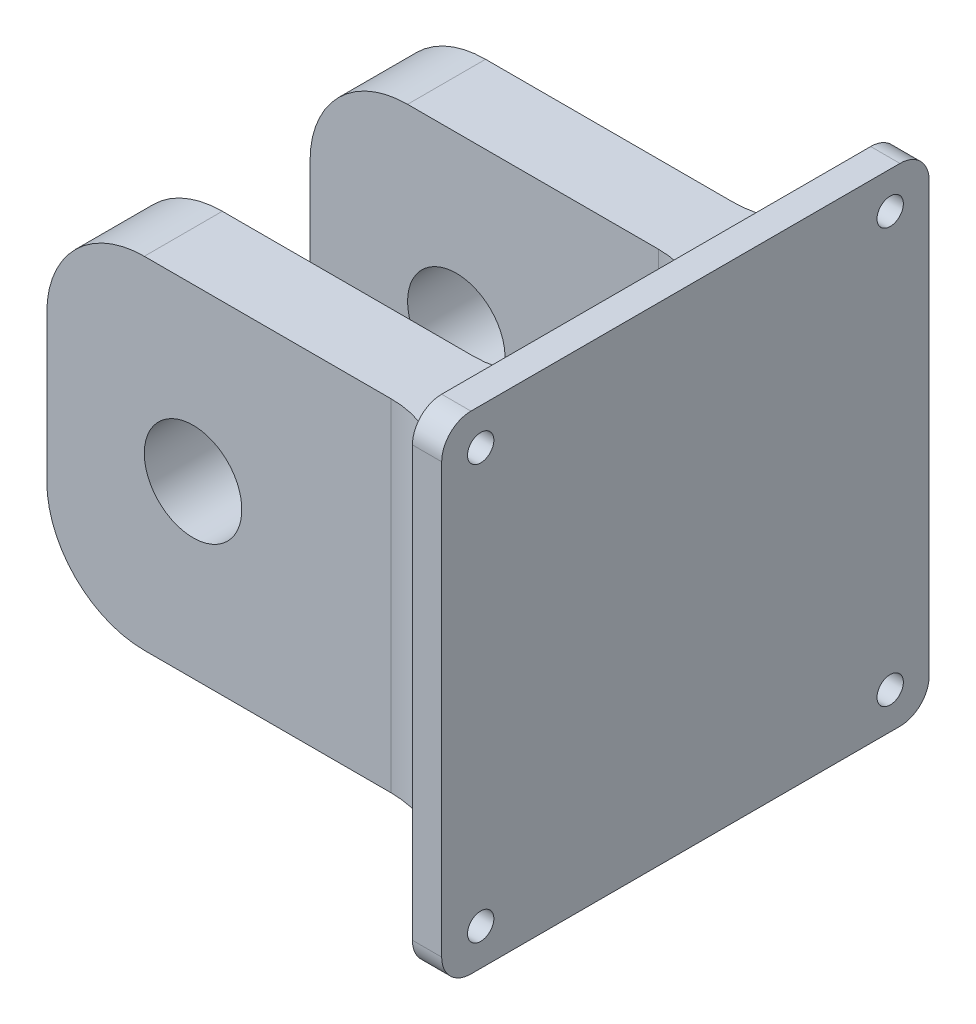
ISO-10303-21;
HEADER;
FILE_DESCRIPTION(('STEP AP214'),'2;1');
FILE_NAME('part.step','',(''),(''),'','','');
FILE_SCHEMA(('AUTOMOTIVE_DESIGN { 1 0 10303 214 1 1 1 1 }'));
ENDSEC;
DATA;
#1=APPLICATION_CONTEXT('core data for automotive mechanical design processes');
#2=APPLICATION_PROTOCOL_DEFINITION('international standard','automotive_design',2000,#1);
#3=PRODUCT_CONTEXT('',#1,'mechanical');
#4=PRODUCT('Part','Part','',(#3));
#5=PRODUCT_RELATED_PRODUCT_CATEGORY('part','',(#4));
#6=PRODUCT_DEFINITION_FORMATION('','',#4);
#7=PRODUCT_DEFINITION_CONTEXT('part definition',#1,'design');
#8=PRODUCT_DEFINITION('design','',#6,#7);
#9=PRODUCT_DEFINITION_SHAPE('','',#8);
#10=(LENGTH_UNIT() NAMED_UNIT(*) SI_UNIT(.MILLI.,.METRE.));
#11=(NAMED_UNIT(*) PLANE_ANGLE_UNIT() SI_UNIT($,.RADIAN.));
#12=(NAMED_UNIT(*) SI_UNIT($,.STERADIAN.) SOLID_ANGLE_UNIT());
#13=UNCERTAINTY_MEASURE_WITH_UNIT(LENGTH_MEASURE(1.E-05),#10,'distance_accuracy_value','');
#14=(GEOMETRIC_REPRESENTATION_CONTEXT(3) GLOBAL_UNCERTAINTY_ASSIGNED_CONTEXT((#13)) GLOBAL_UNIT_ASSIGNED_CONTEXT((#10,
#11,#12)) REPRESENTATION_CONTEXT('',''));
#15=CARTESIAN_POINT('',(0.,0.,0.));
#16=DIRECTION('',(0.,0.,1.));
#17=DIRECTION('',(1.,0.,0.));
#18=AXIS2_PLACEMENT_3D('',#15,#16,#17);
#19=CARTESIAN_POINT('',(0.,0.,0.));
#20=DIRECTION('',(-1.,0.,0.));
#21=DIRECTION('',(0.,0.,1.));
#22=AXIS2_PLACEMENT_3D('',#19,#20,#21);
#23=PLANE('',#22);
#24=CARTESIAN_POINT('',(0.,21.25,21.));
#25=DIRECTION('',(-1.,0.,0.));
#26=DIRECTION('',(0.,0.,1.));
#27=AXIS2_PLACEMENT_3D('',#24,#25,#26);
#28=CIRCLE('',#27,1.35);
#29=CARTESIAN_POINT('',(0.,21.25,22.35));
#30=VERTEX_POINT('',#29);
#31=EDGE_CURVE('E440',#30,#30,#28,.T.);
#32=ORIENTED_EDGE('',*,*,#31,.F.);
#33=EDGE_LOOP('',(#32));
#34=FACE_BOUND('',#33,.T.);
#35=CARTESIAN_POINT('',(0.,21.25,-21.));
#36=DIRECTION('',(-1.,0.,0.));
#37=DIRECTION('',(0.,0.,1.));
#38=AXIS2_PLACEMENT_3D('',#35,#36,#37);
#39=CIRCLE('',#38,1.35);
#40=CARTESIAN_POINT('',(0.,21.25,-19.65));
#41=VERTEX_POINT('',#40);
#42=EDGE_CURVE('E434',#41,#41,#39,.T.);
#43=ORIENTED_EDGE('',*,*,#42,.F.);
#44=EDGE_LOOP('',(#43));
#45=FACE_BOUND('',#44,.T.);
#46=CARTESIAN_POINT('',(0.,-21.25,-21.));
#47=DIRECTION('',(-1.,0.,0.));
#48=DIRECTION('',(0.,0.,1.));
#49=AXIS2_PLACEMENT_3D('',#46,#47,#48);
#50=CIRCLE('',#49,1.35);
#51=CARTESIAN_POINT('',(0.,-21.25,-19.65));
#52=VERTEX_POINT('',#51);
#53=EDGE_CURVE('E428',#52,#52,#50,.T.);
#54=ORIENTED_EDGE('',*,*,#53,.F.);
#55=EDGE_LOOP('',(#54));
#56=FACE_BOUND('',#55,.T.);
#57=CARTESIAN_POINT('',(0.,-21.25,21.));
#58=DIRECTION('',(-1.,0.,0.));
#59=DIRECTION('',(0.,0.,1.));
#60=AXIS2_PLACEMENT_3D('',#57,#58,#59);
#61=CIRCLE('',#60,1.35);
#62=CARTESIAN_POINT('',(0.,-21.25,22.35));
#63=VERTEX_POINT('',#62);
#64=EDGE_CURVE('E422',#63,#63,#61,.T.);
#65=ORIENTED_EDGE('',*,*,#64,.F.);
#66=EDGE_LOOP('',(#65));
#67=FACE_BOUND('',#66,.T.);
#68=DIRECTION('',(0.,0.,-1.));
#69=VECTOR('',#68,1.);
#70=CARTESIAN_POINT('',(0.,-25.,25.));
#71=LINE('',#70,#69);
#72=CARTESIAN_POINT('',(0.,-25.,22.));
#73=VERTEX_POINT('',#72);
#74=CARTESIAN_POINT('',(0.,-25.,-22.));
#75=VERTEX_POINT('',#74);
#76=EDGE_CURVE('E247',#73,#75,#71,.T.);
#77=ORIENTED_EDGE('',*,*,#76,.F.);
#78=CARTESIAN_POINT('',(0.,-22.,22.));
#79=DIRECTION('',(-1.,0.,0.));
#80=DIRECTION('',(0.,0.,1.));
#81=AXIS2_PLACEMENT_3D('',#78,#79,#80);
#82=CIRCLE('',#81,3.);
#83=CARTESIAN_POINT('',(0.,-22.,25.));
#84=VERTEX_POINT('',#83);
#85=EDGE_CURVE('E334',#73,#84,#82,.T.);
#86=ORIENTED_EDGE('',*,*,#85,.T.);
#87=DIRECTION('',(0.,-1.,0.));
#88=VECTOR('',#87,1.);
#89=CARTESIAN_POINT('',(0.,-25.,25.));
#90=LINE('',#89,#88);
#91=CARTESIAN_POINT('',(0.,-17.5,25.));
#92=VERTEX_POINT('',#91);
#93=EDGE_CURVE('E244',#92,#84,#90,.T.);
#94=ORIENTED_EDGE('',*,*,#93,.F.);
#95=DIRECTION('',(0.,0.,1.));
#96=VECTOR('',#95,1.);
#97=CARTESIAN_POINT('',(0.,-17.5,9.49999999999999));
#98=LINE('',#97,#96);
#99=CARTESIAN_POINT('',(0.,-17.5,0.24999999999999));
#100=VERTEX_POINT('',#99);
#101=EDGE_CURVE('E390',#100,#92,#98,.T.);
#102=ORIENTED_EDGE('',*,*,#101,.F.);
#103=DIRECTION('',(0.,-1.,0.));
#104=VECTOR('',#103,1.);
#105=CARTESIAN_POINT('',(0.,0.,0.249999999999992));
#106=LINE('',#105,#104);
#107=CARTESIAN_POINT('',(0.,17.5,0.249999999999993));
#108=VERTEX_POINT('',#107);
#109=EDGE_CURVE('E306',#100,#108,#106,.F.);
#110=ORIENTED_EDGE('',*,*,#109,.T.);
#111=DIRECTION('',(0.,0.,1.));
#112=VECTOR('',#111,1.);
#113=CARTESIAN_POINT('',(0.,17.5,9.49999999999999));
#114=LINE('',#113,#112);
#115=CARTESIAN_POINT('',(0.,17.5,25.));
#116=VERTEX_POINT('',#115);
#117=EDGE_CURVE('E387',#108,#116,#114,.T.);
#118=ORIENTED_EDGE('',*,*,#117,.T.);
#119=CARTESIAN_POINT('',(0.,22.,25.));
#120=VERTEX_POINT('',#119);
#121=EDGE_CURVE('E245',#120,#116,#90,.T.);
#122=ORIENTED_EDGE('',*,*,#121,.F.);
#123=CARTESIAN_POINT('',(0.,22.,22.));
#124=DIRECTION('',(-1.,0.,0.));
#125=DIRECTION('',(0.,0.,1.));
#126=AXIS2_PLACEMENT_3D('',#123,#124,#125);
#127=CIRCLE('',#126,3.);
#128=CARTESIAN_POINT('',(0.,25.,22.));
#129=VERTEX_POINT('',#128);
#130=EDGE_CURVE('E332',#120,#129,#127,.T.);
#131=ORIENTED_EDGE('',*,*,#130,.T.);
#132=DIRECTION('',(0.,0.,1.));
#133=VECTOR('',#132,1.);
#134=CARTESIAN_POINT('',(0.,25.,25.));
#135=LINE('',#134,#133);
#136=CARTESIAN_POINT('',(0.,25.,-22.));
#137=VERTEX_POINT('',#136);
#138=EDGE_CURVE('E209',#137,#129,#135,.T.);
#139=ORIENTED_EDGE('',*,*,#138,.F.);
#140=CARTESIAN_POINT('',(0.,22.,-22.));
#141=DIRECTION('',(-1.,0.,0.));
#142=DIRECTION('',(0.,0.,1.));
#143=AXIS2_PLACEMENT_3D('',#140,#141,#142);
#144=CIRCLE('',#143,3.);
#145=CARTESIAN_POINT('',(0.,22.,-25.));
#146=VERTEX_POINT('',#145);
#147=EDGE_CURVE('E330',#137,#146,#144,.T.);
#148=ORIENTED_EDGE('',*,*,#147,.T.);
#149=DIRECTION('',(0.,1.,0.));
#150=VECTOR('',#149,1.);
#151=CARTESIAN_POINT('',(0.,-25.,-25.));
#152=LINE('',#151,#150);
#153=CARTESIAN_POINT('',(0.,17.5,-25.));
#154=VERTEX_POINT('',#153);
#155=EDGE_CURVE('E211',#154,#146,#152,.T.);
#156=ORIENTED_EDGE('',*,*,#155,.F.);
#157=DIRECTION('',(0.,0.,1.));
#158=VECTOR('',#157,1.);
#159=CARTESIAN_POINT('',(0.,17.5,-17.5));
#160=LINE('',#159,#158);
#161=CARTESIAN_POINT('',(0.,17.5,-0.250000000000014));
#162=VERTEX_POINT('',#161);
#163=EDGE_CURVE('E220',#154,#162,#160,.T.);
#164=ORIENTED_EDGE('',*,*,#163,.T.);
#165=DIRECTION('',(0.,1.,0.));
#166=VECTOR('',#165,1.);
#167=CARTESIAN_POINT('',(0.,0.,-0.250000000000014));
#168=LINE('',#167,#166);
#169=CARTESIAN_POINT('',(0.,-17.5,-0.250000000000014));
#170=VERTEX_POINT('',#169);
#171=EDGE_CURVE('E217',#162,#170,#168,.F.);
#172=ORIENTED_EDGE('',*,*,#171,.T.);
#173=DIRECTION('',(0.,0.,1.));
#174=VECTOR('',#173,1.);
#175=CARTESIAN_POINT('',(0.,-17.5,-17.5));
#176=LINE('',#175,#174);
#177=CARTESIAN_POINT('',(0.,-17.5,-25.));
#178=VERTEX_POINT('',#177);
#179=EDGE_CURVE('E213',#178,#170,#176,.T.);
#180=ORIENTED_EDGE('',*,*,#179,.F.);
#181=CARTESIAN_POINT('',(0.,-22.,-25.));
#182=VERTEX_POINT('',#181);
#183=EDGE_CURVE('E200',#182,#178,#152,.T.);
#184=ORIENTED_EDGE('',*,*,#183,.F.);
#185=CARTESIAN_POINT('',(0.,-22.,-22.));
#186=DIRECTION('',(-1.,0.,0.));
#187=DIRECTION('',(0.,0.,1.));
#188=AXIS2_PLACEMENT_3D('',#185,#186,#187);
#189=CIRCLE('',#188,3.);
#190=EDGE_CURVE('E328',#182,#75,#189,.T.);
#191=ORIENTED_EDGE('',*,*,#190,.T.);
#192=EDGE_LOOP('',(#77,#86,#94,#102,#110,#118,#122,#131,#139,#148,#156,#164,#172,#180,#184,#191));
#193=FACE_BOUND('',#192,.T.);
#194=ADVANCED_FACE('F37',(#34,#45,#56,#67,#193),#23,.T.);
#195=CARTESIAN_POINT('',(3.,-25.,-25.));
#196=DIRECTION('',(0.,0.,1.));
#197=DIRECTION('',(1.,0.,0.));
#198=AXIS2_PLACEMENT_3D('',#195,#196,#197);
#199=PLANE('',#198);
#200=ORIENTED_EDGE('',*,*,#155,.T.);
#201=DIRECTION('',(-1.,0.,0.));
#202=VECTOR('',#201,1.);
#203=CARTESIAN_POINT('',(3.,22.,-25.));
#204=LINE('',#203,#202);
#205=CARTESIAN_POINT('',(3.,22.,-25.));
#206=VERTEX_POINT('',#205);
#207=EDGE_CURVE('E11',#146,#206,#204,.F.);
#208=ORIENTED_EDGE('',*,*,#207,.T.);
#209=DIRECTION('',(0.,1.,0.));
#210=VECTOR('',#209,1.);
#211=CARTESIAN_POINT('',(3.,-25.,-25.));
#212=LINE('',#211,#210);
#213=CARTESIAN_POINT('',(3.,-22.,-25.));
#214=VERTEX_POINT('',#213);
#215=EDGE_CURVE('E251',#214,#206,#212,.T.);
#216=ORIENTED_EDGE('',*,*,#215,.F.);
#217=DIRECTION('',(-1.,0.,0.));
#218=VECTOR('',#217,1.);
#219=CARTESIAN_POINT('',(3.,-22.,-25.));
#220=LINE('',#219,#218);
#221=EDGE_CURVE('E45',#214,#182,#220,.T.);
#222=ORIENTED_EDGE('',*,*,#221,.T.);
#223=ORIENTED_EDGE('',*,*,#183,.T.);
#224=EDGE_CURVE('E205',#178,#154,#152,.T.);
#225=ORIENTED_EDGE('',*,*,#224,.T.);
#226=EDGE_LOOP('',(#200,#208,#216,#222,#223,#225));
#227=FACE_BOUND('',#226,.T.);
#228=ADVANCED_FACE('F203',(#227),#199,.F.);
#229=CARTESIAN_POINT('',(3.,25.,25.));
#230=DIRECTION('',(0.,-1.,0.));
#231=DIRECTION('',(0.,0.,-1.));
#232=AXIS2_PLACEMENT_3D('',#229,#230,#231);
#233=PLANE('',#232);
#234=ORIENTED_EDGE('',*,*,#138,.T.);
#235=DIRECTION('',(-1.,0.,0.));
#236=VECTOR('',#235,1.);
#237=CARTESIAN_POINT('',(3.,25.,22.));
#238=LINE('',#237,#236);
#239=CARTESIAN_POINT('',(3.,25.,22.));
#240=VERTEX_POINT('',#239);
#241=EDGE_CURVE('E52',#129,#240,#238,.F.);
#242=ORIENTED_EDGE('',*,*,#241,.T.);
#243=DIRECTION('',(0.,0.,1.));
#244=VECTOR('',#243,1.);
#245=CARTESIAN_POINT('',(3.,25.,25.));
#246=LINE('',#245,#244);
#247=CARTESIAN_POINT('',(3.,25.,-22.));
#248=VERTEX_POINT('',#247);
#249=EDGE_CURVE('E354',#248,#240,#246,.T.);
#250=ORIENTED_EDGE('',*,*,#249,.F.);
#251=DIRECTION('',(-1.,0.,0.));
#252=VECTOR('',#251,1.);
#253=CARTESIAN_POINT('',(3.,25.,-22.));
#254=LINE('',#253,#252);
#255=EDGE_CURVE('E348',#248,#137,#254,.T.);
#256=ORIENTED_EDGE('',*,*,#255,.T.);
#257=EDGE_LOOP('',(#234,#242,#250,#256));
#258=FACE_BOUND('',#257,.T.);
#259=ADVANCED_FACE('F353',(#258),#233,.F.);
#260=CARTESIAN_POINT('',(3.,-25.,25.));
#261=DIRECTION('',(0.,0.,-1.));
#262=DIRECTION('',(-1.,0.,0.));
#263=AXIS2_PLACEMENT_3D('',#260,#261,#262);
#264=PLANE('',#263);
#265=ORIENTED_EDGE('',*,*,#93,.T.);
#266=DIRECTION('',(-1.,0.,0.));
#267=VECTOR('',#266,1.);
#268=CARTESIAN_POINT('',(3.,-22.,25.));
#269=LINE('',#268,#267);
#270=CARTESIAN_POINT('',(3.,-22.,25.));
#271=VERTEX_POINT('',#270);
#272=EDGE_CURVE('E339',#84,#271,#269,.F.);
#273=ORIENTED_EDGE('',*,*,#272,.T.);
#274=DIRECTION('',(0.,-1.,0.));
#275=VECTOR('',#274,1.);
#276=CARTESIAN_POINT('',(3.,-25.,25.));
#277=LINE('',#276,#275);
#278=CARTESIAN_POINT('',(3.,22.,25.));
#279=VERTEX_POINT('',#278);
#280=EDGE_CURVE('E368',#279,#271,#277,.T.);
#281=ORIENTED_EDGE('',*,*,#280,.F.);
#282=DIRECTION('',(-1.,0.,0.));
#283=VECTOR('',#282,1.);
#284=CARTESIAN_POINT('',(3.,22.,25.));
#285=LINE('',#284,#283);
#286=EDGE_CURVE('E336',#279,#120,#285,.T.);
#287=ORIENTED_EDGE('',*,*,#286,.T.);
#288=ORIENTED_EDGE('',*,*,#121,.T.);
#289=EDGE_CURVE('E248',#116,#92,#90,.T.);
#290=ORIENTED_EDGE('',*,*,#289,.T.);
#291=EDGE_LOOP('',(#265,#273,#281,#287,#288,#290));
#292=FACE_BOUND('',#291,.T.);
#293=ADVANCED_FACE('F365',(#292),#264,.F.);
#294=CARTESIAN_POINT('',(3.,-25.,25.));
#295=DIRECTION('',(0.,1.,0.));
#296=DIRECTION('',(0.,0.,1.));
#297=AXIS2_PLACEMENT_3D('',#294,#295,#296);
#298=PLANE('',#297);
#299=DIRECTION('',(0.,0.,-1.));
#300=VECTOR('',#299,1.);
#301=CARTESIAN_POINT('',(3.,-25.,25.));
#302=LINE('',#301,#300);
#303=CARTESIAN_POINT('',(3.,-25.,22.));
#304=VERTEX_POINT('',#303);
#305=CARTESIAN_POINT('',(3.,-25.,-22.));
#306=VERTEX_POINT('',#305);
#307=EDGE_CURVE('E241',#304,#306,#302,.T.);
#308=ORIENTED_EDGE('',*,*,#307,.F.);
#309=DIRECTION('',(-1.,0.,0.));
#310=VECTOR('',#309,1.);
#311=CARTESIAN_POINT('',(3.,-25.,22.));
#312=LINE('',#311,#310);
#313=EDGE_CURVE('E325',#304,#73,#312,.T.);
#314=ORIENTED_EDGE('',*,*,#313,.T.);
#315=ORIENTED_EDGE('',*,*,#76,.T.);
#316=DIRECTION('',(-1.,0.,0.));
#317=VECTOR('',#316,1.);
#318=CARTESIAN_POINT('',(3.,-25.,-22.));
#319=LINE('',#318,#317);
#320=EDGE_CURVE('E323',#75,#306,#319,.F.);
#321=ORIENTED_EDGE('',*,*,#320,.T.);
#322=EDGE_LOOP('',(#308,#314,#315,#321));
#323=FACE_BOUND('',#322,.T.);
#324=ADVANCED_FACE('F517',(#323),#298,.F.);
#325=CARTESIAN_POINT('',(3.,0.,0.));
#326=DIRECTION('',(-1.,0.,0.));
#327=DIRECTION('',(0.,0.,1.));
#328=AXIS2_PLACEMENT_3D('',#325,#326,#327);
#329=PLANE('',#328);
#330=CARTESIAN_POINT('',(3.,21.25,21.));
#331=DIRECTION('',(-1.,0.,0.));
#332=DIRECTION('',(0.,0.,1.));
#333=AXIS2_PLACEMENT_3D('',#330,#331,#332);
#334=CIRCLE('',#333,1.35);
#335=CARTESIAN_POINT('',(3.,21.25,22.35));
#336=VERTEX_POINT('',#335);
#337=EDGE_CURVE('E437',#336,#336,#334,.T.);
#338=ORIENTED_EDGE('',*,*,#337,.T.);
#339=EDGE_LOOP('',(#338));
#340=FACE_BOUND('',#339,.T.);
#341=CARTESIAN_POINT('',(3.,21.25,-21.));
#342=DIRECTION('',(-1.,0.,0.));
#343=DIRECTION('',(0.,0.,1.));
#344=AXIS2_PLACEMENT_3D('',#341,#342,#343);
#345=CIRCLE('',#344,1.35);
#346=CARTESIAN_POINT('',(3.,21.25,-19.65));
#347=VERTEX_POINT('',#346);
#348=EDGE_CURVE('E431',#347,#347,#345,.T.);
#349=ORIENTED_EDGE('',*,*,#348,.T.);
#350=EDGE_LOOP('',(#349));
#351=FACE_BOUND('',#350,.T.);
#352=CARTESIAN_POINT('',(3.,-21.25,-21.));
#353=DIRECTION('',(-1.,0.,0.));
#354=DIRECTION('',(0.,0.,1.));
#355=AXIS2_PLACEMENT_3D('',#352,#353,#354);
#356=CIRCLE('',#355,1.35);
#357=CARTESIAN_POINT('',(3.,-21.25,-19.65));
#358=VERTEX_POINT('',#357);
#359=EDGE_CURVE('E425',#358,#358,#356,.T.);
#360=ORIENTED_EDGE('',*,*,#359,.T.);
#361=EDGE_LOOP('',(#360));
#362=FACE_BOUND('',#361,.T.);
#363=CARTESIAN_POINT('',(3.,-21.25,21.));
#364=DIRECTION('',(-1.,0.,0.));
#365=DIRECTION('',(0.,0.,1.));
#366=AXIS2_PLACEMENT_3D('',#363,#364,#365);
#367=CIRCLE('',#366,1.35);
#368=CARTESIAN_POINT('',(3.,-21.25,22.35));
#369=VERTEX_POINT('',#368);
#370=EDGE_CURVE('E419',#369,#369,#367,.T.);
#371=ORIENTED_EDGE('',*,*,#370,.T.);
#372=EDGE_LOOP('',(#371));
#373=FACE_BOUND('',#372,.T.);
#374=ORIENTED_EDGE('',*,*,#280,.T.);
#375=CARTESIAN_POINT('',(3.,-22.,22.));
#376=DIRECTION('',(-1.,0.,0.));
#377=DIRECTION('',(0.,0.,1.));
#378=AXIS2_PLACEMENT_3D('',#375,#376,#377);
#379=CIRCLE('',#378,3.);
#380=EDGE_CURVE('E346',#271,#304,#379,.F.);
#381=ORIENTED_EDGE('',*,*,#380,.T.);
#382=ORIENTED_EDGE('',*,*,#307,.T.);
#383=CARTESIAN_POINT('',(3.,-22.,-22.));
#384=DIRECTION('',(-1.,0.,0.));
#385=DIRECTION('',(0.,0.,1.));
#386=AXIS2_PLACEMENT_3D('',#383,#384,#385);
#387=CIRCLE('',#386,3.);
#388=EDGE_CURVE('E341',#306,#214,#387,.F.);
#389=ORIENTED_EDGE('',*,*,#388,.T.);
#390=ORIENTED_EDGE('',*,*,#215,.T.);
#391=CARTESIAN_POINT('',(3.,22.,-22.));
#392=DIRECTION('',(-1.,0.,0.));
#393=DIRECTION('',(0.,0.,1.));
#394=AXIS2_PLACEMENT_3D('',#391,#392,#393);
#395=CIRCLE('',#394,3.);
#396=EDGE_CURVE('E59',#206,#248,#395,.F.);
#397=ORIENTED_EDGE('',*,*,#396,.T.);
#398=ORIENTED_EDGE('',*,*,#249,.T.);
#399=CARTESIAN_POINT('',(3.,22.,22.));
#400=DIRECTION('',(-1.,0.,0.));
#401=DIRECTION('',(0.,0.,1.));
#402=AXIS2_PLACEMENT_3D('',#399,#400,#401);
#403=CIRCLE('',#402,3.);
#404=EDGE_CURVE('E344',#240,#279,#403,.F.);
#405=ORIENTED_EDGE('',*,*,#404,.T.);
#406=EDGE_LOOP('',(#374,#381,#382,#389,#390,#397,#398,#405));
#407=FACE_BOUND('',#406,.T.);
#408=ADVANCED_FACE('F514',(#340,#351,#362,#373,#407),#329,.F.);
#409=CARTESIAN_POINT('',(-45.,17.5,9.49999999999999));
#410=DIRECTION('',(0.,0.,1.));
#411=DIRECTION('',(0.,-1.,0.));
#412=AXIS2_PLACEMENT_3D('',#409,#410,#411);
#413=PLANE('',#412);
#414=CARTESIAN_POINT('',(-30.,0.,9.49999999999999));
#415=DIRECTION('',(0.,0.,1.));
#416=DIRECTION('',(0.,-1.,0.));
#417=AXIS2_PLACEMENT_3D('',#414,#415,#416);
#418=CIRCLE('',#417,5.);
#419=CARTESIAN_POINT('',(-35.,0.,9.49999999999999));
#420=VERTEX_POINT('',#419);
#421=EDGE_CURVE('E405',#420,#420,#418,.T.);
#422=ORIENTED_EDGE('',*,*,#421,.T.);
#423=EDGE_LOOP('',(#422));
#424=FACE_BOUND('',#423,.T.);
#425=DIRECTION('',(1.,0.,0.));
#426=VECTOR('',#425,1.);
#427=CARTESIAN_POINT('',(-45.,17.5,9.49999999999999));
#428=LINE('',#427,#426);
#429=CARTESIAN_POINT('',(-35.,17.5,9.49999999999999));
#430=VERTEX_POINT('',#429);
#431=CARTESIAN_POINT('',(-9.25000000000002,17.5,9.49999999999999));
#432=VERTEX_POINT('',#431);
#433=EDGE_CURVE('E383',#430,#432,#428,.T.);
#434=ORIENTED_EDGE('',*,*,#433,.T.);
#435=DIRECTION('',(0.,-1.,0.));
#436=VECTOR('',#435,1.);
#437=CARTESIAN_POINT('',(-9.25,17.5,9.49999999999999));
#438=LINE('',#437,#436);
#439=CARTESIAN_POINT('',(-9.25000000000002,-17.5,9.49999999999999));
#440=VERTEX_POINT('',#439);
#441=EDGE_CURVE('E310',#432,#440,#438,.T.);
#442=ORIENTED_EDGE('',*,*,#441,.T.);
#443=DIRECTION('',(1.,0.,0.));
#444=VECTOR('',#443,1.);
#445=CARTESIAN_POINT('',(-45.,-17.5,9.49999999999999));
#446=LINE('',#445,#444);
#447=CARTESIAN_POINT('',(-35.,-17.5,9.49999999999999));
#448=VERTEX_POINT('',#447);
#449=EDGE_CURVE('E238',#448,#440,#446,.T.);
#450=ORIENTED_EDGE('',*,*,#449,.F.);
#451=CARTESIAN_POINT('',(-35.,-7.5,9.49999999999999));
#452=DIRECTION('',(0.,0.,1.));
#453=DIRECTION('',(0.,-1.,0.));
#454=AXIS2_PLACEMENT_3D('',#451,#452,#453);
#455=CIRCLE('',#454,10.);
#456=CARTESIAN_POINT('',(-45.,-7.5,9.49999999999999));
#457=VERTEX_POINT('',#456);
#458=EDGE_CURVE('E278',#448,#457,#455,.F.);
#459=ORIENTED_EDGE('',*,*,#458,.T.);
#460=DIRECTION('',(0.,-1.,0.));
#461=VECTOR('',#460,1.);
#462=CARTESIAN_POINT('',(-45.,17.5,9.49999999999999));
#463=LINE('',#462,#461);
#464=CARTESIAN_POINT('',(-45.,7.50000000000001,9.49999999999999));
#465=VERTEX_POINT('',#464);
#466=EDGE_CURVE('E389',#465,#457,#463,.T.);
#467=ORIENTED_EDGE('',*,*,#466,.F.);
#468=CARTESIAN_POINT('',(-35.,7.50000000000001,9.49999999999999));
#469=DIRECTION('',(0.,0.,1.));
#470=DIRECTION('',(0.,-1.,0.));
#471=AXIS2_PLACEMENT_3D('',#468,#469,#470);
#472=CIRCLE('',#471,10.);
#473=EDGE_CURVE('E280',#465,#430,#472,.F.);
#474=ORIENTED_EDGE('',*,*,#473,.T.);
#475=EDGE_LOOP('',(#434,#442,#450,#459,#467,#474));
#476=FACE_BOUND('',#475,.T.);
#477=ADVANCED_FACE('F510',(#424,#476),#413,.F.);
#478=CARTESIAN_POINT('',(-45.,-17.5,9.49999999999999));
#479=DIRECTION('',(0.,1.,0.));
#480=DIRECTION('',(0.,0.,1.));
#481=AXIS2_PLACEMENT_3D('',#478,#479,#480);
#482=PLANE('',#481);
#483=DIRECTION('',(1.,0.,0.));
#484=VECTOR('',#483,1.);
#485=CARTESIAN_POINT('',(-45.,-17.5,17.5));
#486=LINE('',#485,#484);
#487=CARTESIAN_POINT('',(-35.,-17.5,17.5));
#488=VERTEX_POINT('',#487);
#489=CARTESIAN_POINT('',(-9.68245836551856,-17.5,17.5));
#490=VERTEX_POINT('',#489);
#491=EDGE_CURVE('E377',#488,#490,#486,.T.);
#492=ORIENTED_EDGE('',*,*,#491,.F.);
#493=DIRECTION('',(0.,0.,1.));
#494=VECTOR('',#493,1.);
#495=CARTESIAN_POINT('',(-35.,-17.5,9.49999999999999));
#496=LINE('',#495,#494);
#497=EDGE_CURVE('E282',#488,#448,#496,.F.);
#498=ORIENTED_EDGE('',*,*,#497,.T.);
#499=ORIENTED_EDGE('',*,*,#449,.T.);
#500=CARTESIAN_POINT('',(-9.25,-17.5,0.24999999999999));
#501=DIRECTION('',(0.,1.,0.));
#502=DIRECTION('',(0.,0.,1.));
#503=AXIS2_PLACEMENT_3D('',#500,#501,#502);
#504=CIRCLE('',#503,9.25);
#505=EDGE_CURVE('E318',#440,#100,#504,.T.);
#506=ORIENTED_EDGE('',*,*,#505,.T.);
#507=ORIENTED_EDGE('',*,*,#101,.T.);
#508=CARTESIAN_POINT('',(-9.68245836551854,-17.5,27.5));
#509=DIRECTION('',(0.,1.,0.));
#510=DIRECTION('',(0.,0.,1.));
#511=AXIS2_PLACEMENT_3D('',#508,#509,#510);
#512=CIRCLE('',#511,10.);
#513=EDGE_CURVE('E301',#92,#490,#512,.T.);
#514=ORIENTED_EDGE('',*,*,#513,.T.);
#515=EDGE_LOOP('',(#492,#498,#499,#506,#507,#514));
#516=FACE_BOUND('',#515,.T.);
#517=ADVANCED_FACE('F506',(#516),#482,.F.);
#518=CARTESIAN_POINT('',(-45.,-17.5,17.5));
#519=DIRECTION('',(0.,0.,-1.));
#520=DIRECTION('',(-1.,0.,0.));
#521=AXIS2_PLACEMENT_3D('',#518,#519,#520);
#522=PLANE('',#521);
#523=CARTESIAN_POINT('',(-30.,0.,17.5));
#524=DIRECTION('',(0.,0.,-1.));
#525=DIRECTION('',(-1.,0.,0.));
#526=AXIS2_PLACEMENT_3D('',#523,#524,#525);
#527=CIRCLE('',#526,5.);
#528=CARTESIAN_POINT('',(-35.,0.,17.5));
#529=VERTEX_POINT('',#528);
#530=EDGE_CURVE('E255',#529,#529,#527,.T.);
#531=ORIENTED_EDGE('',*,*,#530,.T.);
#532=EDGE_LOOP('',(#531));
#533=FACE_BOUND('',#532,.T.);
#534=ORIENTED_EDGE('',*,*,#491,.T.);
#535=DIRECTION('',(0.,-1.,0.));
#536=VECTOR('',#535,1.);
#537=CARTESIAN_POINT('',(-9.68245836551854,-17.5,17.5));
#538=LINE('',#537,#536);
#539=CARTESIAN_POINT('',(-9.68245836551856,17.5,17.5));
#540=VERTEX_POINT('',#539);
#541=EDGE_CURVE('E267',#490,#540,#538,.F.);
#542=ORIENTED_EDGE('',*,*,#541,.T.);
#543=DIRECTION('',(1.,0.,0.));
#544=VECTOR('',#543,1.);
#545=CARTESIAN_POINT('',(-45.,17.5,17.5));
#546=LINE('',#545,#544);
#547=CARTESIAN_POINT('',(-35.,17.5,17.5));
#548=VERTEX_POINT('',#547);
#549=EDGE_CURVE('E380',#548,#540,#546,.T.);
#550=ORIENTED_EDGE('',*,*,#549,.F.);
#551=CARTESIAN_POINT('',(-35.,7.50000000000001,17.5));
#552=DIRECTION('',(0.,0.,-1.));
#553=DIRECTION('',(-1.,0.,0.));
#554=AXIS2_PLACEMENT_3D('',#551,#552,#553);
#555=CIRCLE('',#554,10.);
#556=CARTESIAN_POINT('',(-45.,7.50000000000001,17.5));
#557=VERTEX_POINT('',#556);
#558=EDGE_CURVE('E265',#548,#557,#555,.F.);
#559=ORIENTED_EDGE('',*,*,#558,.T.);
#560=DIRECTION('',(0.,1.,0.));
#561=VECTOR('',#560,1.);
#562=CARTESIAN_POINT('',(-45.,-17.5,17.5));
#563=LINE('',#562,#561);
#564=CARTESIAN_POINT('',(-45.,-7.5,17.5));
#565=VERTEX_POINT('',#564);
#566=EDGE_CURVE('E386',#565,#557,#563,.T.);
#567=ORIENTED_EDGE('',*,*,#566,.F.);
#568=CARTESIAN_POINT('',(-35.,-7.5,17.5));
#569=DIRECTION('',(0.,0.,-1.));
#570=DIRECTION('',(-1.,0.,0.));
#571=AXIS2_PLACEMENT_3D('',#568,#569,#570);
#572=CIRCLE('',#571,10.);
#573=EDGE_CURVE('E263',#565,#488,#572,.F.);
#574=ORIENTED_EDGE('',*,*,#573,.T.);
#575=EDGE_LOOP('',(#534,#542,#550,#559,#567,#574));
#576=FACE_BOUND('',#575,.T.);
#577=ADVANCED_FACE('F502',(#533,#576),#522,.F.);
#578=CARTESIAN_POINT('',(-45.,17.5,9.49999999999999));
#579=DIRECTION('',(0.,1.,0.));
#580=DIRECTION('',(0.,0.,1.));
#581=AXIS2_PLACEMENT_3D('',#578,#579,#580);
#582=PLANE('',#581);
#583=ORIENTED_EDGE('',*,*,#433,.F.);
#584=DIRECTION('',(0.,0.,1.));
#585=VECTOR('',#584,1.);
#586=CARTESIAN_POINT('',(-35.,17.5,9.49999999999999));
#587=LINE('',#586,#585);
#588=EDGE_CURVE('E270',#430,#548,#587,.T.);
#589=ORIENTED_EDGE('',*,*,#588,.T.);
#590=ORIENTED_EDGE('',*,*,#549,.T.);
#591=CARTESIAN_POINT('',(-9.68245836551854,17.5,27.5));
#592=DIRECTION('',(0.,1.,0.));
#593=DIRECTION('',(0.,0.,1.));
#594=AXIS2_PLACEMENT_3D('',#591,#592,#593);
#595=CIRCLE('',#594,10.);
#596=EDGE_CURVE('E232',#540,#116,#595,.F.);
#597=ORIENTED_EDGE('',*,*,#596,.T.);
#598=ORIENTED_EDGE('',*,*,#117,.F.);
#599=CARTESIAN_POINT('',(-9.25,17.5,0.249999999999993));
#600=DIRECTION('',(0.,1.,0.));
#601=DIRECTION('',(0.,0.,1.));
#602=AXIS2_PLACEMENT_3D('',#599,#600,#601);
#603=CIRCLE('',#602,9.25);
#604=EDGE_CURVE('E321',#108,#432,#603,.F.);
#605=ORIENTED_EDGE('',*,*,#604,.T.);
#606=EDGE_LOOP('',(#583,#589,#590,#597,#598,#605));
#607=FACE_BOUND('',#606,.T.);
#608=ADVANCED_FACE('F498',(#607),#582,.T.);
#609=CARTESIAN_POINT('',(-45.,0.,0.));
#610=DIRECTION('',(-1.,0.,0.));
#611=DIRECTION('',(0.,0.,1.));
#612=AXIS2_PLACEMENT_3D('',#609,#610,#611);
#613=PLANE('',#612);
#614=ORIENTED_EDGE('',*,*,#566,.T.);
#615=DIRECTION('',(0.,0.,1.));
#616=VECTOR('',#615,1.);
#617=CARTESIAN_POINT('',(-45.,7.50000000000001,0.));
#618=LINE('',#617,#616);
#619=EDGE_CURVE('E276',#557,#465,#618,.F.);
#620=ORIENTED_EDGE('',*,*,#619,.T.);
#621=ORIENTED_EDGE('',*,*,#466,.T.);
#622=DIRECTION('',(0.,0.,1.));
#623=VECTOR('',#622,1.);
#624=CARTESIAN_POINT('',(-45.,-7.5,17.5));
#625=LINE('',#624,#623);
#626=EDGE_CURVE('E273',#457,#565,#625,.T.);
#627=ORIENTED_EDGE('',*,*,#626,.T.);
#628=EDGE_LOOP('',(#614,#620,#621,#627));
#629=FACE_BOUND('',#628,.T.);
#630=ADVANCED_FACE('F480',(#629),#613,.T.);
#631=CARTESIAN_POINT('',(-45.,-17.5,-17.5));
#632=DIRECTION('',(0.,0.,-1.));
#633=DIRECTION('',(-1.,0.,0.));
#634=AXIS2_PLACEMENT_3D('',#631,#632,#633);
#635=PLANE('',#634);
#636=CARTESIAN_POINT('',(-30.,0.,-17.5));
#637=DIRECTION('',(0.,0.,-1.));
#638=DIRECTION('',(-1.,0.,0.));
#639=AXIS2_PLACEMENT_3D('',#636,#637,#638);
#640=CIRCLE('',#639,5.);
#641=CARTESIAN_POINT('',(-35.,0.,-17.5));
#642=VERTEX_POINT('',#641);
#643=EDGE_CURVE('E256',#642,#642,#640,.T.);
#644=ORIENTED_EDGE('',*,*,#643,.F.);
#645=EDGE_LOOP('',(#644));
#646=FACE_BOUND('',#645,.T.);
#647=DIRECTION('',(1.,0.,0.));
#648=VECTOR('',#647,1.);
#649=CARTESIAN_POINT('',(-45.,17.5,-17.5));
#650=LINE('',#649,#648);
#651=CARTESIAN_POINT('',(-35.,17.5,-17.5));
#652=VERTEX_POINT('',#651);
#653=CARTESIAN_POINT('',(-9.68245836551855,17.5,-17.5));
#654=VERTEX_POINT('',#653);
#655=EDGE_CURVE('E401',#652,#654,#650,.T.);
#656=ORIENTED_EDGE('',*,*,#655,.T.);
#657=DIRECTION('',(0.,-1.,0.));
#658=VECTOR('',#657,1.);
#659=CARTESIAN_POINT('',(-9.68245836551854,-17.5,-17.5));
#660=LINE('',#659,#658);
#661=CARTESIAN_POINT('',(-9.68245836551855,-17.5,-17.5));
#662=VERTEX_POINT('',#661);
#663=EDGE_CURVE('E261',#654,#662,#660,.T.);
#664=ORIENTED_EDGE('',*,*,#663,.T.);
#665=DIRECTION('',(1.,0.,0.));
#666=VECTOR('',#665,1.);
#667=CARTESIAN_POINT('',(-45.,-17.5,-17.5));
#668=LINE('',#667,#666);
#669=CARTESIAN_POINT('',(-35.,-17.5,-17.5));
#670=VERTEX_POINT('',#669);
#671=EDGE_CURVE('E229',#670,#662,#668,.T.);
#672=ORIENTED_EDGE('',*,*,#671,.F.);
#673=CARTESIAN_POINT('',(-35.,-7.5,-17.5));
#674=DIRECTION('',(0.,0.,-1.));
#675=DIRECTION('',(-1.,0.,0.));
#676=AXIS2_PLACEMENT_3D('',#673,#674,#675);
#677=CIRCLE('',#676,10.);
#678=CARTESIAN_POINT('',(-45.,-7.5,-17.5));
#679=VERTEX_POINT('',#678);
#680=EDGE_CURVE('E259',#670,#679,#677,.T.);
#681=ORIENTED_EDGE('',*,*,#680,.T.);
#682=DIRECTION('',(0.,1.,0.));
#683=VECTOR('',#682,1.);
#684=CARTESIAN_POINT('',(-45.,-17.5,-17.5));
#685=LINE('',#684,#683);
#686=CARTESIAN_POINT('',(-45.,7.50000000000001,-17.5));
#687=VERTEX_POINT('',#686);
#688=EDGE_CURVE('E221',#679,#687,#685,.T.);
#689=ORIENTED_EDGE('',*,*,#688,.T.);
#690=CARTESIAN_POINT('',(-35.,7.50000000000001,-17.5));
#691=DIRECTION('',(0.,0.,-1.));
#692=DIRECTION('',(-1.,0.,0.));
#693=AXIS2_PLACEMENT_3D('',#690,#691,#692);
#694=CIRCLE('',#693,10.);
#695=EDGE_CURVE('E257',#687,#652,#694,.T.);
#696=ORIENTED_EDGE('',*,*,#695,.T.);
#697=EDGE_LOOP('',(#656,#664,#672,#681,#689,#696));
#698=FACE_BOUND('',#697,.T.);
#699=ADVANCED_FACE('F477',(#646,#698),#635,.T.);
#700=CARTESIAN_POINT('',(-45.,-17.5,-17.5));
#701=DIRECTION('',(0.,1.,0.));
#702=DIRECTION('',(0.,0.,1.));
#703=AXIS2_PLACEMENT_3D('',#700,#701,#702);
#704=PLANE('',#703);
#705=DIRECTION('',(1.,0.,0.));
#706=VECTOR('',#705,1.);
#707=CARTESIAN_POINT('',(-45.,-17.5,-9.50000000000001));
#708=LINE('',#707,#706);
#709=CARTESIAN_POINT('',(-35.,-17.5,-9.50000000000001));
#710=VERTEX_POINT('',#709);
#711=CARTESIAN_POINT('',(-9.25000000000002,-17.5,-9.50000000000001));
#712=VERTEX_POINT('',#711);
#713=EDGE_CURVE('E404',#710,#712,#708,.T.);
#714=ORIENTED_EDGE('',*,*,#713,.F.);
#715=DIRECTION('',(0.,0.,1.));
#716=VECTOR('',#715,1.);
#717=CARTESIAN_POINT('',(-35.,-17.5,-17.5));
#718=LINE('',#717,#716);
#719=EDGE_CURVE('E293',#710,#670,#718,.F.);
#720=ORIENTED_EDGE('',*,*,#719,.T.);
#721=ORIENTED_EDGE('',*,*,#671,.T.);
#722=CARTESIAN_POINT('',(-9.68245836551854,-17.5,-27.5));
#723=DIRECTION('',(0.,1.,0.));
#724=DIRECTION('',(0.,0.,1.));
#725=AXIS2_PLACEMENT_3D('',#722,#723,#724);
#726=CIRCLE('',#725,10.);
#727=EDGE_CURVE('E225',#662,#178,#726,.T.);
#728=ORIENTED_EDGE('',*,*,#727,.T.);
#729=ORIENTED_EDGE('',*,*,#179,.T.);
#730=CARTESIAN_POINT('',(-9.25,-17.5,-0.250000000000014));
#731=DIRECTION('',(0.,1.,0.));
#732=DIRECTION('',(0.,0.,1.));
#733=AXIS2_PLACEMENT_3D('',#730,#731,#732);
#734=CIRCLE('',#733,9.25);
#735=EDGE_CURVE('E316',#170,#712,#734,.T.);
#736=ORIENTED_EDGE('',*,*,#735,.T.);
#737=EDGE_LOOP('',(#714,#720,#721,#728,#729,#736));
#738=FACE_BOUND('',#737,.T.);
#739=ADVANCED_FACE('F227',(#738),#704,.F.);
#740=CARTESIAN_POINT('',(-45.,-17.5,-9.50000000000001));
#741=DIRECTION('',(0.,0.,-1.));
#742=DIRECTION('',(-1.,0.,0.));
#743=AXIS2_PLACEMENT_3D('',#740,#741,#742);
#744=PLANE('',#743);
#745=CARTESIAN_POINT('',(-30.,0.,-9.50000000000001));
#746=DIRECTION('',(0.,0.,-1.));
#747=DIRECTION('',(-1.,0.,0.));
#748=AXIS2_PLACEMENT_3D('',#745,#746,#747);
#749=CIRCLE('',#748,5.);
#750=CARTESIAN_POINT('',(-35.,0.,-9.50000000000001));
#751=VERTEX_POINT('',#750);
#752=EDGE_CURVE('E252',#751,#751,#749,.T.);
#753=ORIENTED_EDGE('',*,*,#752,.T.);
#754=EDGE_LOOP('',(#753));
#755=FACE_BOUND('',#754,.T.);
#756=ORIENTED_EDGE('',*,*,#713,.T.);
#757=DIRECTION('',(0.,1.,0.));
#758=VECTOR('',#757,1.);
#759=CARTESIAN_POINT('',(-9.25,-17.5,-9.50000000000001));
#760=LINE('',#759,#758);
#761=CARTESIAN_POINT('',(-9.25000000000002,17.5,-9.50000000000001));
#762=VERTEX_POINT('',#761);
#763=EDGE_CURVE('E303',#712,#762,#760,.T.);
#764=ORIENTED_EDGE('',*,*,#763,.T.);
#765=DIRECTION('',(1.,0.,0.));
#766=VECTOR('',#765,1.);
#767=CARTESIAN_POINT('',(-45.,17.5,-9.50000000000001));
#768=LINE('',#767,#766);
#769=CARTESIAN_POINT('',(-35.,17.5,-9.50000000000001));
#770=VERTEX_POINT('',#769);
#771=EDGE_CURVE('E408',#770,#762,#768,.T.);
#772=ORIENTED_EDGE('',*,*,#771,.F.);
#773=CARTESIAN_POINT('',(-35.,7.50000000000001,-9.50000000000001));
#774=DIRECTION('',(0.,0.,-1.));
#775=DIRECTION('',(-1.,0.,0.));
#776=AXIS2_PLACEMENT_3D('',#773,#774,#775);
#777=CIRCLE('',#776,10.);
#778=CARTESIAN_POINT('',(-45.,7.50000000000001,-9.50000000000001));
#779=VERTEX_POINT('',#778);
#780=EDGE_CURVE('E289',#770,#779,#777,.F.);
#781=ORIENTED_EDGE('',*,*,#780,.T.);
#782=DIRECTION('',(0.,1.,0.));
#783=VECTOR('',#782,1.);
#784=CARTESIAN_POINT('',(-45.,-17.5,-9.50000000000001));
#785=LINE('',#784,#783);
#786=CARTESIAN_POINT('',(-45.,-7.5,-9.50000000000001));
#787=VERTEX_POINT('',#786);
#788=EDGE_CURVE('E398',#787,#779,#785,.T.);
#789=ORIENTED_EDGE('',*,*,#788,.F.);
#790=CARTESIAN_POINT('',(-35.,-7.5,-9.50000000000001));
#791=DIRECTION('',(0.,0.,-1.));
#792=DIRECTION('',(-1.,0.,0.));
#793=AXIS2_PLACEMENT_3D('',#790,#791,#792);
#794=CIRCLE('',#793,10.);
#795=EDGE_CURVE('E291',#787,#710,#794,.F.);
#796=ORIENTED_EDGE('',*,*,#795,.T.);
#797=EDGE_LOOP('',(#756,#764,#772,#781,#789,#796));
#798=FACE_BOUND('',#797,.T.);
#799=ADVANCED_FACE('F486',(#755,#798),#744,.F.);
#800=CARTESIAN_POINT('',(-45.,17.5,-17.5));
#801=DIRECTION('',(0.,1.,0.));
#802=DIRECTION('',(0.,0.,1.));
#803=AXIS2_PLACEMENT_3D('',#800,#801,#802);
#804=PLANE('',#803);
#805=ORIENTED_EDGE('',*,*,#655,.F.);
#806=DIRECTION('',(0.,0.,1.));
#807=VECTOR('',#806,1.);
#808=CARTESIAN_POINT('',(-35.,17.5,-9.50000000000001));
#809=LINE('',#808,#807);
#810=EDGE_CURVE('E295',#652,#770,#809,.T.);
#811=ORIENTED_EDGE('',*,*,#810,.T.);
#812=ORIENTED_EDGE('',*,*,#771,.T.);
#813=CARTESIAN_POINT('',(-9.25,17.5,-0.250000000000014));
#814=DIRECTION('',(0.,1.,0.));
#815=DIRECTION('',(0.,0.,1.));
#816=AXIS2_PLACEMENT_3D('',#813,#814,#815);
#817=CIRCLE('',#816,9.25);
#818=EDGE_CURVE('E313',#762,#162,#817,.F.);
#819=ORIENTED_EDGE('',*,*,#818,.T.);
#820=ORIENTED_EDGE('',*,*,#163,.F.);
#821=CARTESIAN_POINT('',(-9.68245836551854,17.5,-27.5));
#822=DIRECTION('',(0.,1.,0.));
#823=DIRECTION('',(0.,0.,1.));
#824=AXIS2_PLACEMENT_3D('',#821,#822,#823);
#825=CIRCLE('',#824,10.);
#826=EDGE_CURVE('E233',#154,#654,#825,.F.);
#827=ORIENTED_EDGE('',*,*,#826,.T.);
#828=EDGE_LOOP('',(#805,#811,#812,#819,#820,#827));
#829=FACE_BOUND('',#828,.T.);
#830=ADVANCED_FACE('F482',(#829),#804,.T.);
#831=CARTESIAN_POINT('',(-45.,0.,0.));
#832=DIRECTION('',(1.,0.,0.));
#833=DIRECTION('',(0.,0.,-1.));
#834=AXIS2_PLACEMENT_3D('',#831,#832,#833);
#835=PLANE('',#834);
#836=ORIENTED_EDGE('',*,*,#688,.F.);
#837=DIRECTION('',(0.,0.,1.));
#838=VECTOR('',#837,1.);
#839=CARTESIAN_POINT('',(-45.,-7.5,0.));
#840=LINE('',#839,#838);
#841=EDGE_CURVE('E286',#679,#787,#840,.T.);
#842=ORIENTED_EDGE('',*,*,#841,.T.);
#843=ORIENTED_EDGE('',*,*,#788,.T.);
#844=DIRECTION('',(0.,0.,1.));
#845=VECTOR('',#844,1.);
#846=CARTESIAN_POINT('',(-45.,7.50000000000001,-17.5));
#847=LINE('',#846,#845);
#848=EDGE_CURVE('E284',#779,#687,#847,.F.);
#849=ORIENTED_EDGE('',*,*,#848,.T.);
#850=EDGE_LOOP('',(#836,#842,#843,#849));
#851=FACE_BOUND('',#850,.T.);
#852=ADVANCED_FACE('F485',(#851),#835,.F.);
#853=CARTESIAN_POINT('',(-30.,0.,22.5));
#854=DIRECTION('',(0.,0.,-1.));
#855=DIRECTION('',(-1.,0.,0.));
#856=AXIS2_PLACEMENT_3D('',#853,#854,#855);
#857=CYLINDRICAL_SURFACE('',#856,5.);
#858=ORIENTED_EDGE('',*,*,#643,.T.);
#859=EDGE_LOOP('',(#858));
#860=FACE_BOUND('',#859,.T.);
#861=ORIENTED_EDGE('',*,*,#752,.F.);
#862=EDGE_LOOP('',(#861));
#863=FACE_BOUND('',#862,.T.);
#864=ADVANCED_FACE('F475',(#860,#863),#857,.F.);
#865=CARTESIAN_POINT('',(-35.,0.,17.5));
#866=CARTESIAN_POINT('',(-35.,0.,17.4166666666667));
#867=CARTESIAN_POINT('',(-35.,0.,17.3333333333333));
#868=CARTESIAN_POINT('',(-35.,0.,17.1666666666667));
#869=CARTESIAN_POINT('',(-35.,0.,17.0833333333333));
#870=CARTESIAN_POINT('',(-35.,0.,16.9166666666667));
#871=CARTESIAN_POINT('',(-35.,0.,16.8333333333333));
#872=CARTESIAN_POINT('',(-35.,0.,16.6666666666667));
#873=CARTESIAN_POINT('',(-35.,0.,16.5833333333333));
#874=CARTESIAN_POINT('',(-35.,0.,16.4166666666667));
#875=CARTESIAN_POINT('',(-35.,0.,16.3333333333333));
#876=CARTESIAN_POINT('',(-35.,0.,16.1666666666667));
#877=CARTESIAN_POINT('',(-35.,0.,16.0833333333333));
#878=CARTESIAN_POINT('',(-35.,0.,15.9166666666667));
#879=CARTESIAN_POINT('',(-35.,0.,15.8333333333333));
#880=CARTESIAN_POINT('',(-35.,0.,15.6666666666667));
#881=CARTESIAN_POINT('',(-35.,0.,15.5833333333333));
#882=CARTESIAN_POINT('',(-35.,0.,15.4166666666667));
#883=CARTESIAN_POINT('',(-35.,0.,15.3333333333333));
#884=CARTESIAN_POINT('',(-35.,0.,15.1666666666667));
#885=CARTESIAN_POINT('',(-35.,0.,15.0833333333333));
#886=CARTESIAN_POINT('',(-35.,0.,14.9166666666667));
#887=CARTESIAN_POINT('',(-35.,0.,14.8333333333333));
#888=CARTESIAN_POINT('',(-35.,0.,14.6666666666667));
#889=CARTESIAN_POINT('',(-35.,0.,14.5833333333333));
#890=CARTESIAN_POINT('',(-35.,0.,14.4166666666667));
#891=CARTESIAN_POINT('',(-35.,0.,14.3333333333333));
#892=CARTESIAN_POINT('',(-35.,0.,14.1666666666667));
#893=CARTESIAN_POINT('',(-35.,0.,14.0833333333333));
#894=CARTESIAN_POINT('',(-35.,0.,13.9166666666667));
#895=CARTESIAN_POINT('',(-35.,0.,13.8333333333333));
#896=CARTESIAN_POINT('',(-35.,0.,13.6666666666667));
#897=CARTESIAN_POINT('',(-35.,0.,13.5833333333333));
#898=CARTESIAN_POINT('',(-35.,0.,13.4166666666667));
#899=CARTESIAN_POINT('',(-35.,0.,13.3333333333333));
#900=CARTESIAN_POINT('',(-35.,0.,13.1666666666667));
#901=CARTESIAN_POINT('',(-35.,0.,13.0833333333333));
#902=CARTESIAN_POINT('',(-35.,0.,12.9166666666667));
#903=CARTESIAN_POINT('',(-35.,0.,12.8333333333333));
#904=CARTESIAN_POINT('',(-35.,0.,12.6666666666667));
#905=CARTESIAN_POINT('',(-35.,0.,12.5833333333333));
#906=CARTESIAN_POINT('',(-35.,0.,12.4166666666667));
#907=CARTESIAN_POINT('',(-35.,0.,12.3333333333333));
#908=CARTESIAN_POINT('',(-35.,0.,12.1666666666667));
#909=CARTESIAN_POINT('',(-35.,0.,12.0833333333333));
#910=CARTESIAN_POINT('',(-35.,0.,11.9166666666667));
#911=CARTESIAN_POINT('',(-35.,0.,11.8333333333333));
#912=CARTESIAN_POINT('',(-35.,0.,11.6666666666667));
#913=CARTESIAN_POINT('',(-35.,0.,11.5833333333333));
#914=CARTESIAN_POINT('',(-35.,0.,11.4166666666667));
#915=CARTESIAN_POINT('',(-35.,0.,11.3333333333333));
#916=CARTESIAN_POINT('',(-35.,0.,11.1666666666667));
#917=CARTESIAN_POINT('',(-35.,0.,11.0833333333333));
#918=CARTESIAN_POINT('',(-35.,0.,10.9166666666667));
#919=CARTESIAN_POINT('',(-35.,0.,10.8333333333333));
#920=CARTESIAN_POINT('',(-35.,0.,10.6666666666667));
#921=CARTESIAN_POINT('',(-35.,0.,10.5833333333333));
#922=CARTESIAN_POINT('',(-35.,0.,10.4166666666667));
#923=CARTESIAN_POINT('',(-35.,0.,10.3333333333333));
#924=CARTESIAN_POINT('',(-35.,0.,10.1666666666667));
#925=CARTESIAN_POINT('',(-35.,0.,10.0833333333333));
#926=CARTESIAN_POINT('',(-35.,0.,9.91666666666666));
#927=CARTESIAN_POINT('',(-35.,0.,9.83333333333332));
#928=CARTESIAN_POINT('',(-35.,0.,9.66666666666666));
#929=CARTESIAN_POINT('',(-35.,0.,9.58333333333332));
#930=CARTESIAN_POINT('',(-35.,0.,9.49999999999999));
#931=B_SPLINE_CURVE_WITH_KNOTS('',3,(#865,#866,#867,#868,#869,#870,#871,#872,#873,#874,#875,
#876,#877,#878,#879,#880,#881,#882,#883,#884,#885,#886,#887,#888,#889,#890,#891,#892,#893,#894,
#895,#896,#897,#898,#899,#900,#901,#902,#903,#904,#905,#906,#907,#908,#909,#910,#911,#912,#913,
#914,#915,#916,#917,#918,#919,#920,#921,#922,#923,#924,#925,#926,#927,#928,#929,#930),
.UNSPECIFIED.,.F.,.F.,(4,2,2,2,2,2,2,2,2,2,2,2,2,2,2,2,2,2,2,2,2,2,2,2,2,2,2,2,2,2,2,2,4),(0.,
0.25,0.5,0.750000000000001,1.,1.25,1.5,1.75,2.,2.25,2.5,2.75,3.,3.25,3.5,3.75,4.,4.25,4.5,4.75,
5.,5.25,5.50000000000001,5.75000000000001,6.00000000000001,6.25000000000001,6.50000000000001,
6.75000000000001,7.00000000000001,7.25000000000001,7.50000000000001,7.75000000000001,
8.00000000000001),.UNSPECIFIED.);
#932=EDGE_CURVE('BSEAM472',#529,#420,#931,.T.);
#933=ORIENTED_EDGE('',*,*,#530,.F.);
#934=ORIENTED_EDGE('',*,*,#421,.F.);
#935=ORIENTED_EDGE('',*,*,#932,.T.);
#936=ORIENTED_EDGE('',*,*,#932,.F.);
#937=EDGE_LOOP('',(#933,#935,#934,#936));
#938=FACE_BOUND('',#937,.T.);
#939=ADVANCED_FACE('F472',(#938),#857,.F.);
#940=CARTESIAN_POINT('',(-9.68245836551854,0.,-27.5));
#941=DIRECTION('',(0.,1.,0.));
#942=DIRECTION('',(0.,0.,1.));
#943=AXIS2_PLACEMENT_3D('',#940,#941,#942);
#944=CYLINDRICAL_SURFACE('',#943,10.);
#945=ORIENTED_EDGE('',*,*,#727,.F.);
#946=ORIENTED_EDGE('',*,*,#663,.F.);
#947=ORIENTED_EDGE('',*,*,#826,.F.);
#948=ORIENTED_EDGE('',*,*,#224,.F.);
#949=EDGE_LOOP('',(#945,#946,#947,#948));
#950=FACE_BOUND('',#949,.T.);
#951=ADVANCED_FACE('F236',(#950),#944,.F.);
#952=CARTESIAN_POINT('',(-9.68245836551854,0.,27.5));
#953=DIRECTION('',(0.,-1.,0.));
#954=DIRECTION('',(0.,0.,-1.));
#955=AXIS2_PLACEMENT_3D('',#952,#953,#954);
#956=CYLINDRICAL_SURFACE('',#955,10.);
#957=ORIENTED_EDGE('',*,*,#513,.F.);
#958=ORIENTED_EDGE('',*,*,#289,.F.);
#959=ORIENTED_EDGE('',*,*,#596,.F.);
#960=ORIENTED_EDGE('',*,*,#541,.F.);
#961=EDGE_LOOP('',(#957,#958,#959,#960));
#962=FACE_BOUND('',#961,.T.);
#963=ADVANCED_FACE('F531',(#962),#956,.F.);
#964=CARTESIAN_POINT('',(-35.,7.50000000000001,9.49999999999999));
#965=DIRECTION('',(0.,0.,1.));
#966=DIRECTION('',(1.,0.,0.));
#967=AXIS2_PLACEMENT_3D('',#964,#965,#966);
#968=CYLINDRICAL_SURFACE('',#967,10.);
#969=ORIENTED_EDGE('',*,*,#473,.F.);
#970=ORIENTED_EDGE('',*,*,#619,.F.);
#971=ORIENTED_EDGE('',*,*,#558,.F.);
#972=ORIENTED_EDGE('',*,*,#588,.F.);
#973=EDGE_LOOP('',(#969,#970,#971,#972));
#974=FACE_BOUND('',#973,.T.);
#975=ADVANCED_FACE('F534',(#974),#968,.T.);
#976=CARTESIAN_POINT('',(-35.,-7.49999999999999,0.));
#977=DIRECTION('',(0.,0.,-1.));
#978=DIRECTION('',(0.,1.,0.));
#979=AXIS2_PLACEMENT_3D('',#976,#977,#978);
#980=CYLINDRICAL_SURFACE('',#979,10.);
#981=ORIENTED_EDGE('',*,*,#458,.F.);
#982=ORIENTED_EDGE('',*,*,#497,.F.);
#983=ORIENTED_EDGE('',*,*,#573,.F.);
#984=ORIENTED_EDGE('',*,*,#626,.F.);
#985=EDGE_LOOP('',(#981,#982,#983,#984));
#986=FACE_BOUND('',#985,.T.);
#987=ADVANCED_FACE('F538',(#986),#980,.T.);
#988=CARTESIAN_POINT('',(-35.,-7.5,0.));
#989=DIRECTION('',(0.,0.,1.));
#990=DIRECTION('',(1.,0.,0.));
#991=AXIS2_PLACEMENT_3D('',#988,#989,#990);
#992=CYLINDRICAL_SURFACE('',#991,10.);
#993=ORIENTED_EDGE('',*,*,#680,.F.);
#994=ORIENTED_EDGE('',*,*,#719,.F.);
#995=ORIENTED_EDGE('',*,*,#795,.F.);
#996=ORIENTED_EDGE('',*,*,#841,.F.);
#997=EDGE_LOOP('',(#993,#994,#995,#996));
#998=FACE_BOUND('',#997,.T.);
#999=ADVANCED_FACE('F542',(#998),#992,.T.);
#1000=CARTESIAN_POINT('',(-35.,7.50000000000001,-17.5));
#1001=DIRECTION('',(0.,0.,-1.));
#1002=DIRECTION('',(-1.,0.,0.));
#1003=AXIS2_PLACEMENT_3D('',#1000,#1001,#1002);
#1004=CYLINDRICAL_SURFACE('',#1003,10.);
#1005=ORIENTED_EDGE('',*,*,#695,.F.);
#1006=ORIENTED_EDGE('',*,*,#848,.F.);
#1007=ORIENTED_EDGE('',*,*,#780,.F.);
#1008=ORIENTED_EDGE('',*,*,#810,.F.);
#1009=EDGE_LOOP('',(#1005,#1006,#1007,#1008));
#1010=FACE_BOUND('',#1009,.T.);
#1011=ADVANCED_FACE('F546',(#1010),#1004,.T.);
#1012=CARTESIAN_POINT('',(-9.25,-17.5,-0.250000000000014));
#1013=DIRECTION('',(0.,1.,0.));
#1014=DIRECTION('',(0.,0.,1.));
#1015=AXIS2_PLACEMENT_3D('',#1012,#1013,#1014);
#1016=CYLINDRICAL_SURFACE('',#1015,9.25);
#1017=ORIENTED_EDGE('',*,*,#735,.F.);
#1018=ORIENTED_EDGE('',*,*,#171,.F.);
#1019=ORIENTED_EDGE('',*,*,#818,.F.);
#1020=ORIENTED_EDGE('',*,*,#763,.F.);
#1021=EDGE_LOOP('',(#1017,#1018,#1019,#1020));
#1022=FACE_BOUND('',#1021,.T.);
#1023=ADVANCED_FACE('F550',(#1022),#1016,.F.);
#1024=CARTESIAN_POINT('',(-9.25,17.5,0.249999999999993));
#1025=DIRECTION('',(0.,-1.,0.));
#1026=DIRECTION('',(0.,0.,-1.));
#1027=AXIS2_PLACEMENT_3D('',#1024,#1025,#1026);
#1028=CYLINDRICAL_SURFACE('',#1027,9.25);
#1029=ORIENTED_EDGE('',*,*,#604,.F.);
#1030=ORIENTED_EDGE('',*,*,#109,.F.);
#1031=ORIENTED_EDGE('',*,*,#505,.F.);
#1032=ORIENTED_EDGE('',*,*,#441,.F.);
#1033=EDGE_LOOP('',(#1029,#1030,#1031,#1032));
#1034=FACE_BOUND('',#1033,.T.);
#1035=ADVANCED_FACE('F554',(#1034),#1028,.F.);
#1036=CARTESIAN_POINT('',(3.,-22.,22.));
#1037=DIRECTION('',(-1.,0.,0.));
#1038=DIRECTION('',(0.,0.,1.));
#1039=AXIS2_PLACEMENT_3D('',#1036,#1037,#1038);
#1040=CYLINDRICAL_SURFACE('',#1039,3.);
#1041=ORIENTED_EDGE('',*,*,#380,.F.);
#1042=ORIENTED_EDGE('',*,*,#272,.F.);
#1043=ORIENTED_EDGE('',*,*,#85,.F.);
#1044=ORIENTED_EDGE('',*,*,#313,.F.);
#1045=EDGE_LOOP('',(#1041,#1042,#1043,#1044));
#1046=FACE_BOUND('',#1045,.T.);
#1047=ADVANCED_FACE('F558',(#1046),#1040,.T.);
#1048=CARTESIAN_POINT('',(3.,22.,22.));
#1049=DIRECTION('',(-1.,0.,0.));
#1050=DIRECTION('',(0.,0.,1.));
#1051=AXIS2_PLACEMENT_3D('',#1048,#1049,#1050);
#1052=CYLINDRICAL_SURFACE('',#1051,3.);
#1053=ORIENTED_EDGE('',*,*,#404,.F.);
#1054=ORIENTED_EDGE('',*,*,#241,.F.);
#1055=ORIENTED_EDGE('',*,*,#130,.F.);
#1056=ORIENTED_EDGE('',*,*,#286,.F.);
#1057=EDGE_LOOP('',(#1053,#1054,#1055,#1056));
#1058=FACE_BOUND('',#1057,.T.);
#1059=ADVANCED_FACE('F361',(#1058),#1052,.T.);
#1060=CARTESIAN_POINT('',(3.,22.,-22.));
#1061=DIRECTION('',(-1.,0.,0.));
#1062=DIRECTION('',(0.,0.,1.));
#1063=AXIS2_PLACEMENT_3D('',#1060,#1061,#1062);
#1064=CYLINDRICAL_SURFACE('',#1063,3.);
#1065=ORIENTED_EDGE('',*,*,#396,.F.);
#1066=ORIENTED_EDGE('',*,*,#207,.F.);
#1067=ORIENTED_EDGE('',*,*,#147,.F.);
#1068=ORIENTED_EDGE('',*,*,#255,.F.);
#1069=EDGE_LOOP('',(#1065,#1066,#1067,#1068));
#1070=FACE_BOUND('',#1069,.T.);
#1071=ADVANCED_FACE('F467',(#1070),#1064,.T.);
#1072=CARTESIAN_POINT('',(3.,-22.,-22.));
#1073=DIRECTION('',(-1.,0.,0.));
#1074=DIRECTION('',(0.,0.,1.));
#1075=AXIS2_PLACEMENT_3D('',#1072,#1073,#1074);
#1076=CYLINDRICAL_SURFACE('',#1075,3.);
#1077=ORIENTED_EDGE('',*,*,#388,.F.);
#1078=ORIENTED_EDGE('',*,*,#320,.F.);
#1079=ORIENTED_EDGE('',*,*,#190,.F.);
#1080=ORIENTED_EDGE('',*,*,#221,.F.);
#1081=EDGE_LOOP('',(#1077,#1078,#1079,#1080));
#1082=FACE_BOUND('',#1081,.T.);
#1083=ADVANCED_FACE('F39',(#1082),#1076,.T.);
#1084=CARTESIAN_POINT('',(0.,-21.25,21.));
#1085=DIRECTION('',(-1.,0.,0.));
#1086=DIRECTION('',(0.,0.,1.));
#1087=AXIS2_PLACEMENT_3D('',#1084,#1085,#1086);
#1088=CYLINDRICAL_SURFACE('',#1087,1.35);
#1089=ORIENTED_EDGE('',*,*,#370,.F.);
#1090=EDGE_LOOP('',(#1089));
#1091=FACE_BOUND('',#1090,.T.);
#1092=ORIENTED_EDGE('',*,*,#64,.T.);
#1093=EDGE_LOOP('',(#1092));
#1094=FACE_BOUND('',#1093,.T.);
#1095=ADVANCED_FACE('F455',(#1091,#1094),#1088,.F.);
#1096=CARTESIAN_POINT('',(0.,-21.25,-21.));
#1097=DIRECTION('',(-1.,0.,0.));
#1098=DIRECTION('',(0.,0.,1.));
#1099=AXIS2_PLACEMENT_3D('',#1096,#1097,#1098);
#1100=CYLINDRICAL_SURFACE('',#1099,1.35);
#1101=ORIENTED_EDGE('',*,*,#359,.F.);
#1102=EDGE_LOOP('',(#1101));
#1103=FACE_BOUND('',#1102,.T.);
#1104=ORIENTED_EDGE('',*,*,#53,.T.);
#1105=EDGE_LOOP('',(#1104));
#1106=FACE_BOUND('',#1105,.T.);
#1107=ADVANCED_FACE('F457',(#1103,#1106),#1100,.F.);
#1108=CARTESIAN_POINT('',(0.,21.25,-21.));
#1109=DIRECTION('',(-1.,0.,0.));
#1110=DIRECTION('',(0.,0.,1.));
#1111=AXIS2_PLACEMENT_3D('',#1108,#1109,#1110);
#1112=CYLINDRICAL_SURFACE('',#1111,1.35);
#1113=ORIENTED_EDGE('',*,*,#348,.F.);
#1114=EDGE_LOOP('',(#1113));
#1115=FACE_BOUND('',#1114,.T.);
#1116=ORIENTED_EDGE('',*,*,#42,.T.);
#1117=EDGE_LOOP('',(#1116));
#1118=FACE_BOUND('',#1117,.T.);
#1119=ADVANCED_FACE('F464',(#1115,#1118),#1112,.F.);
#1120=CARTESIAN_POINT('',(0.,21.25,21.));
#1121=DIRECTION('',(-1.,0.,0.));
#1122=DIRECTION('',(0.,0.,1.));
#1123=AXIS2_PLACEMENT_3D('',#1120,#1121,#1122);
#1124=CYLINDRICAL_SURFACE('',#1123,1.35);
#1125=ORIENTED_EDGE('',*,*,#337,.F.);
#1126=EDGE_LOOP('',(#1125));
#1127=FACE_BOUND('',#1126,.T.);
#1128=ORIENTED_EDGE('',*,*,#31,.T.);
#1129=EDGE_LOOP('',(#1128));
#1130=FACE_BOUND('',#1129,.T.);
#1131=ADVANCED_FACE('F444',(#1127,#1130),#1124,.F.);
#1132=CLOSED_SHELL('',(#194,#228,#259,#293,#324,#408,#477,#517,#577,#608,#630,#699,#739,#799,
#830,#852,#864,#939,#951,#963,#975,#987,#999,#1011,#1023,#1035,#1047,#1059,#1071,#1083,#1095,
#1107,#1119,#1131));
#1133=MANIFOLD_SOLID_BREP('B2',#1132);
#1134=ADVANCED_BREP_SHAPE_REPRESENTATION('',(#18,#1133),#14);
#1135=SHAPE_DEFINITION_REPRESENTATION(#9,#1134);
ENDSEC;
END-ISO-10303-21;
